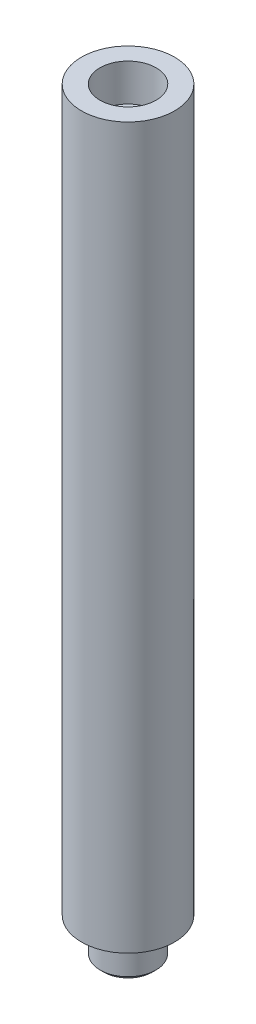
ISO-10303-21;
HEADER;
FILE_DESCRIPTION(('STEP AP214'),'2;1');
FILE_NAME('part.step','',(''),(''),'','','');
FILE_SCHEMA(('AUTOMOTIVE_DESIGN { 1 0 10303 214 1 1 1 1 }'));
ENDSEC;
DATA;
#1=APPLICATION_CONTEXT('core data for automotive mechanical design processes');
#2=APPLICATION_PROTOCOL_DEFINITION('international standard','automotive_design',2000,#1);
#3=PRODUCT_CONTEXT('',#1,'mechanical');
#4=PRODUCT('Part','Part','',(#3));
#5=PRODUCT_RELATED_PRODUCT_CATEGORY('part','',(#4));
#6=PRODUCT_DEFINITION_FORMATION('','',#4);
#7=PRODUCT_DEFINITION_CONTEXT('part definition',#1,'design');
#8=PRODUCT_DEFINITION('design','',#6,#7);
#9=PRODUCT_DEFINITION_SHAPE('','',#8);
#10=(LENGTH_UNIT() NAMED_UNIT(*) SI_UNIT(.MILLI.,.METRE.));
#11=(NAMED_UNIT(*) PLANE_ANGLE_UNIT() SI_UNIT($,.RADIAN.));
#12=(NAMED_UNIT(*) SI_UNIT($,.STERADIAN.) SOLID_ANGLE_UNIT());
#13=UNCERTAINTY_MEASURE_WITH_UNIT(LENGTH_MEASURE(1.E-05),#10,'distance_accuracy_value','');
#14=(GEOMETRIC_REPRESENTATION_CONTEXT(3) GLOBAL_UNCERTAINTY_ASSIGNED_CONTEXT((#13)) GLOBAL_UNIT_ASSIGNED_CONTEXT((#10,
#11,#12)) REPRESENTATION_CONTEXT('',''));
#15=CARTESIAN_POINT('',(0.,0.,0.));
#16=DIRECTION('',(0.,0.,1.));
#17=DIRECTION('',(1.,0.,0.));
#18=AXIS2_PLACEMENT_3D('',#15,#16,#17);
#19=CARTESIAN_POINT('',(7.5,0.,0.));
#20=DIRECTION('',(0.,-1.,0.));
#21=DIRECTION('',(0.,0.,-1.));
#22=AXIS2_PLACEMENT_3D('',#19,#20,#21);
#23=PLANE('',#22);
#24=CARTESIAN_POINT('',(0.,0.,0.));
#25=DIRECTION('',(0.,-1.,0.));
#26=DIRECTION('',(0.,0.,-1.));
#27=AXIS2_PLACEMENT_3D('',#24,#25,#26);
#28=CIRCLE('',#27,6.50000000000001);
#29=CARTESIAN_POINT('',(0.,0.,-6.50000000000001));
#30=VERTEX_POINT('',#29);
#31=EDGE_CURVE('E50',#30,#30,#28,.T.);
#32=ORIENTED_EDGE('',*,*,#31,.T.);
#33=EDGE_LOOP('',(#32));
#34=FACE_BOUND('',#33,.T.);
#35=CARTESIAN_POINT('',(0.,0.,0.));
#36=DIRECTION('',(0.,-1.,0.));
#37=DIRECTION('',(0.,0.,-1.));
#38=AXIS2_PLACEMENT_3D('',#35,#36,#37);
#39=CIRCLE('',#38,4.);
#40=CARTESIAN_POINT('',(0.,0.,-4.));
#41=VERTEX_POINT('',#40);
#42=EDGE_CURVE('E58',#41,#41,#39,.T.);
#43=ORIENTED_EDGE('',*,*,#42,.F.);
#44=EDGE_LOOP('',(#43));
#45=FACE_BOUND('',#44,.T.);
#46=ADVANCED_FACE('F39',(#34,#45),#23,.T.);
#47=CARTESIAN_POINT('',(0.,0.,0.));
#48=DIRECTION('',(0.,-1.,0.));
#49=DIRECTION('',(0.,0.,-1.));
#50=AXIS2_PLACEMENT_3D('',#47,#48,#49);
#51=CYLINDRICAL_SURFACE('',#50,4.);
#52=CARTESIAN_POINT('',(0.,192.2,0.));
#53=DIRECTION('',(0.,1.,0.));
#54=DIRECTION('',(0.,0.,1.));
#55=AXIS2_PLACEMENT_3D('',#52,#53,#54);
#56=CIRCLE('',#55,4.);
#57=CARTESIAN_POINT('',(0.,192.2,4.));
#58=VERTEX_POINT('',#57);
#59=EDGE_CURVE('E51',#58,#58,#56,.T.);
#60=ORIENTED_EDGE('',*,*,#59,.T.);
#61=EDGE_LOOP('',(#60));
#62=FACE_BOUND('',#61,.T.);
#63=ORIENTED_EDGE('',*,*,#42,.T.);
#64=EDGE_LOOP('',(#63));
#65=FACE_BOUND('',#64,.T.);
#66=ADVANCED_FACE('F100',(#62,#65),#51,.F.);
#67=CARTESIAN_POINT('',(7.55,193.2,0.));
#68=DIRECTION('',(0.,1.,0.));
#69=DIRECTION('',(0.,0.,1.));
#70=AXIS2_PLACEMENT_3D('',#67,#68,#69);
#71=PLANE('',#70);
#72=CARTESIAN_POINT('',(0.,193.2,0.));
#73=DIRECTION('',(0.,1.,0.));
#74=DIRECTION('',(0.,0.,1.));
#75=AXIS2_PLACEMENT_3D('',#72,#73,#74);
#76=CIRCLE('',#75,5.);
#77=CARTESIAN_POINT('',(0.,193.2,5.));
#78=VERTEX_POINT('',#77);
#79=EDGE_CURVE('E54',#78,#78,#76,.F.);
#80=ORIENTED_EDGE('',*,*,#79,.T.);
#81=EDGE_LOOP('',(#80));
#82=FACE_BOUND('',#81,.T.);
#83=CARTESIAN_POINT('',(0.,193.2,0.));
#84=DIRECTION('',(0.,-1.,0.));
#85=DIRECTION('',(0.,0.,-1.));
#86=AXIS2_PLACEMENT_3D('',#83,#84,#85);
#87=CIRCLE('',#86,7.55);
#88=CARTESIAN_POINT('',(0.,193.2,-7.55));
#89=VERTEX_POINT('',#88);
#90=EDGE_CURVE('E62',#89,#89,#87,.T.);
#91=ORIENTED_EDGE('',*,*,#90,.F.);
#92=EDGE_LOOP('',(#91));
#93=FACE_BOUND('',#92,.T.);
#94=ADVANCED_FACE('F105',(#82,#93),#71,.T.);
#95=CARTESIAN_POINT('',(0.,0.,0.));
#96=DIRECTION('',(0.,-1.,0.));
#97=DIRECTION('',(0.,0.,-1.));
#98=AXIS2_PLACEMENT_3D('',#95,#96,#97);
#99=CYLINDRICAL_SURFACE('',#98,7.55);
#100=ORIENTED_EDGE('',*,*,#90,.T.);
#101=EDGE_LOOP('',(#100));
#102=FACE_BOUND('',#101,.T.);
#103=CARTESIAN_POINT('',(0.,203.2,0.));
#104=DIRECTION('',(0.,-1.,0.));
#105=DIRECTION('',(0.,0.,-1.));
#106=AXIS2_PLACEMENT_3D('',#103,#104,#105);
#107=CIRCLE('',#106,7.55);
#108=CARTESIAN_POINT('',(0.,203.2,-7.55));
#109=VERTEX_POINT('',#108);
#110=EDGE_CURVE('E66',#109,#109,#107,.T.);
#111=ORIENTED_EDGE('',*,*,#110,.F.);
#112=EDGE_LOOP('',(#111));
#113=FACE_BOUND('',#112,.T.);
#114=ADVANCED_FACE('F121',(#102,#113),#99,.F.);
#115=CARTESIAN_POINT('',(7.55,203.2,0.));
#116=DIRECTION('',(0.,1.,0.));
#117=DIRECTION('',(0.,0.,1.));
#118=AXIS2_PLACEMENT_3D('',#115,#116,#117);
#119=PLANE('',#118);
#120=ORIENTED_EDGE('',*,*,#110,.T.);
#121=EDGE_LOOP('',(#120));
#122=FACE_BOUND('',#121,.T.);
#123=CARTESIAN_POINT('',(0.,203.2,0.));
#124=DIRECTION('',(0.,-1.,0.));
#125=DIRECTION('',(0.,0.,-1.));
#126=AXIS2_PLACEMENT_3D('',#123,#124,#125);
#127=CIRCLE('',#126,12.5);
#128=CARTESIAN_POINT('',(0.,203.2,-12.5));
#129=VERTEX_POINT('',#128);
#130=EDGE_CURVE('E67',#129,#129,#127,.T.);
#131=ORIENTED_EDGE('',*,*,#130,.F.);
#132=EDGE_LOOP('',(#131));
#133=FACE_BOUND('',#132,.T.);
#134=ADVANCED_FACE('F91',(#122,#133),#119,.T.);
#135=CARTESIAN_POINT('',(0.,0.,0.));
#136=DIRECTION('',(0.,-1.,0.));
#137=DIRECTION('',(0.,0.,-1.));
#138=AXIS2_PLACEMENT_3D('',#135,#136,#137);
#139=CYLINDRICAL_SURFACE('',#138,12.5);
#140=ORIENTED_EDGE('',*,*,#130,.T.);
#141=EDGE_LOOP('',(#140));
#142=FACE_BOUND('',#141,.T.);
#143=CARTESIAN_POINT('',(0.,10.,0.));
#144=DIRECTION('',(0.,-1.,0.));
#145=DIRECTION('',(0.,0.,-1.));
#146=AXIS2_PLACEMENT_3D('',#143,#144,#145);
#147=CIRCLE('',#146,12.5);
#148=CARTESIAN_POINT('',(0.,10.,-12.5));
#149=VERTEX_POINT('',#148);
#150=EDGE_CURVE('E75',#149,#149,#147,.T.);
#151=ORIENTED_EDGE('',*,*,#150,.F.);
#152=EDGE_LOOP('',(#151));
#153=FACE_BOUND('',#152,.T.);
#154=ADVANCED_FACE('F83',(#142,#153),#139,.T.);
#155=CARTESIAN_POINT('',(12.5,10.,0.));
#156=DIRECTION('',(0.,-1.,0.));
#157=DIRECTION('',(0.,0.,-1.));
#158=AXIS2_PLACEMENT_3D('',#155,#156,#157);
#159=PLANE('',#158);
#160=ORIENTED_EDGE('',*,*,#150,.T.);
#161=EDGE_LOOP('',(#160));
#162=FACE_BOUND('',#161,.T.);
#163=CARTESIAN_POINT('',(0.,10.,0.));
#164=DIRECTION('',(0.,-1.,0.));
#165=DIRECTION('',(0.,0.,-1.));
#166=AXIS2_PLACEMENT_3D('',#163,#164,#165);
#167=CIRCLE('',#166,7.5);
#168=CARTESIAN_POINT('',(0.,10.,-7.5));
#169=VERTEX_POINT('',#168);
#170=EDGE_CURVE('E73',#169,#169,#167,.T.);
#171=ORIENTED_EDGE('',*,*,#170,.F.);
#172=EDGE_LOOP('',(#171));
#173=FACE_BOUND('',#172,.T.);
#174=ADVANCED_FACE('F81',(#162,#173),#159,.T.);
#175=CARTESIAN_POINT('',(0.,0.,0.));
#176=DIRECTION('',(0.,-1.,0.));
#177=DIRECTION('',(0.,0.,-1.));
#178=AXIS2_PLACEMENT_3D('',#175,#176,#177);
#179=CYLINDRICAL_SURFACE('',#178,7.5);
#180=CARTESIAN_POINT('',(0.,0.999999999999995,0.));
#181=DIRECTION('',(0.,-1.,0.));
#182=DIRECTION('',(0.,0.,-1.));
#183=AXIS2_PLACEMENT_3D('',#180,#181,#182);
#184=CIRCLE('',#183,7.5);
#185=CARTESIAN_POINT('',(0.,0.999999999999995,-7.5));
#186=VERTEX_POINT('',#185);
#187=EDGE_CURVE('E10',#186,#186,#184,.F.);
#188=ORIENTED_EDGE('',*,*,#187,.T.);
#189=EDGE_LOOP('',(#188));
#190=FACE_BOUND('',#189,.T.);
#191=ORIENTED_EDGE('',*,*,#170,.T.);
#192=EDGE_LOOP('',(#191));
#193=FACE_BOUND('',#192,.T.);
#194=ADVANCED_FACE('F78',(#190,#193),#179,.T.);
#195=CARTESIAN_POINT('',(0.,193.2,0.));
#196=DIRECTION('',(0.,1.,0.));
#197=DIRECTION('',(0.,0.,1.));
#198=AXIS2_PLACEMENT_3D('',#195,#196,#197);
#199=CONICAL_SURFACE('',#198,5.,0.78539816339745);
#200=ORIENTED_EDGE('',*,*,#59,.F.);
#201=EDGE_LOOP('',(#200));
#202=FACE_BOUND('',#201,.T.);
#203=ORIENTED_EDGE('',*,*,#79,.F.);
#204=EDGE_LOOP('',(#203));
#205=FACE_BOUND('',#204,.T.);
#206=ADVANCED_FACE('F93',(#202,#205),#199,.F.);
#207=CARTESIAN_POINT('',(0.,0.,0.));
#208=DIRECTION('',(0.,1.,0.));
#209=DIRECTION('',(0.,0.,1.));
#210=AXIS2_PLACEMENT_3D('',#207,#208,#209);
#211=CONICAL_SURFACE('',#210,6.50000000000001,0.785398163397449);
#212=ORIENTED_EDGE('',*,*,#187,.F.);
#213=EDGE_LOOP('',(#212));
#214=FACE_BOUND('',#213,.T.);
#215=ORIENTED_EDGE('',*,*,#31,.F.);
#216=EDGE_LOOP('',(#215));
#217=FACE_BOUND('',#216,.T.);
#218=ADVANCED_FACE('F45',(#214,#217),#211,.T.);
#219=CLOSED_SHELL('',(#46,#66,#94,#114,#134,#154,#174,#194,#206,#218));
#220=MANIFOLD_SOLID_BREP('B2',#219);
#221=ADVANCED_BREP_SHAPE_REPRESENTATION('',(#18,#220),#14);
#222=SHAPE_DEFINITION_REPRESENTATION(#9,#221);
ENDSEC;
END-ISO-10303-21;
